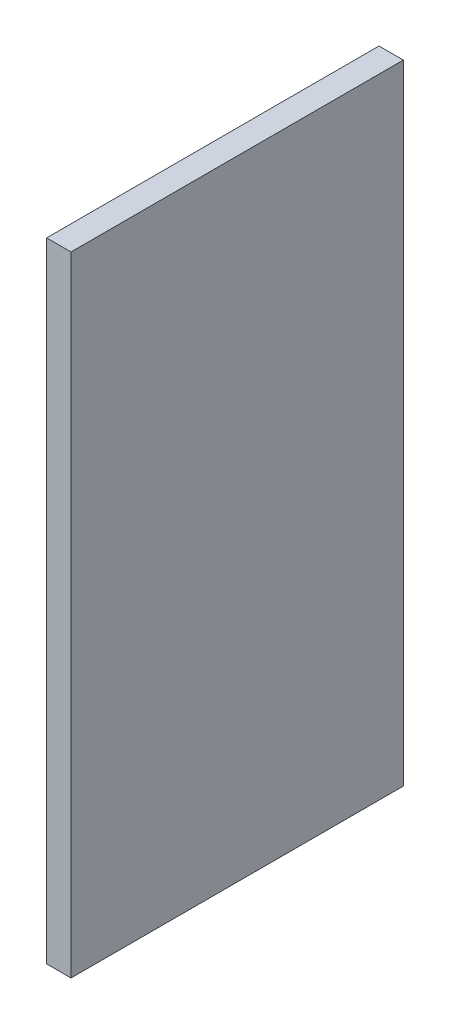
ISO-10303-21;
HEADER;
FILE_DESCRIPTION(('STEP AP214'),'2;1');
FILE_NAME('part.step','',(''),(''),'','','');
FILE_SCHEMA(('AUTOMOTIVE_DESIGN { 1 0 10303 214 1 1 1 1 }'));
ENDSEC;
DATA;
#1=APPLICATION_CONTEXT('core data for automotive mechanical design processes');
#2=APPLICATION_PROTOCOL_DEFINITION('international standard','automotive_design',2000,#1);
#3=PRODUCT_CONTEXT('',#1,'mechanical');
#4=PRODUCT('Part','Part','',(#3));
#5=PRODUCT_RELATED_PRODUCT_CATEGORY('part','',(#4));
#6=PRODUCT_DEFINITION_FORMATION('','',#4);
#7=PRODUCT_DEFINITION_CONTEXT('part definition',#1,'design');
#8=PRODUCT_DEFINITION('design','',#6,#7);
#9=PRODUCT_DEFINITION_SHAPE('','',#8);
#10=(LENGTH_UNIT() NAMED_UNIT(*) SI_UNIT(.MILLI.,.METRE.));
#11=(NAMED_UNIT(*) PLANE_ANGLE_UNIT() SI_UNIT($,.RADIAN.));
#12=(NAMED_UNIT(*) SI_UNIT($,.STERADIAN.) SOLID_ANGLE_UNIT());
#13=UNCERTAINTY_MEASURE_WITH_UNIT(LENGTH_MEASURE(1.E-05),#10,'distance_accuracy_value','');
#14=(GEOMETRIC_REPRESENTATION_CONTEXT(3) GLOBAL_UNCERTAINTY_ASSIGNED_CONTEXT((#13)) GLOBAL_UNIT_ASSIGNED_CONTEXT((#10,
#11,#12)) REPRESENTATION_CONTEXT('',''));
#15=CARTESIAN_POINT('',(0.,0.,0.));
#16=DIRECTION('',(0.,0.,1.));
#17=DIRECTION('',(1.,0.,0.));
#18=AXIS2_PLACEMENT_3D('',#15,#16,#17);
#19=CARTESIAN_POINT('',(1338.5,121.5,-818.5));
#20=DIRECTION('',(-1.,0.,0.));
#21=DIRECTION('',(0.,0.,1.));
#22=AXIS2_PLACEMENT_3D('',#19,#20,#21);
#23=PLANE('',#22);
#24=DIRECTION('',(0.,-1.,0.));
#25=VECTOR('',#24,1.);
#26=CARTESIAN_POINT('',(1338.5,121.5,0.));
#27=LINE('',#26,#25);
#28=CARTESIAN_POINT('',(1338.5,1670.,0.));
#29=VERTEX_POINT('',#28);
#30=CARTESIAN_POINT('',(1338.5,121.5,0.));
#31=VERTEX_POINT('',#30);
#32=EDGE_CURVE('E103',#29,#31,#27,.T.);
#33=ORIENTED_EDGE('',*,*,#32,.F.);
#34=DIRECTION('',(0.,0.,1.));
#35=VECTOR('',#34,1.);
#36=CARTESIAN_POINT('',(1338.5,1670.,-818.5));
#37=LINE('',#36,#35);
#38=CARTESIAN_POINT('',(1338.5,1670.,-818.5));
#39=VERTEX_POINT('',#38);
#40=EDGE_CURVE('E11',#39,#29,#37,.T.);
#41=ORIENTED_EDGE('',*,*,#40,.F.);
#42=DIRECTION('',(0.,-1.,0.));
#43=VECTOR('',#42,1.);
#44=CARTESIAN_POINT('',(1338.5,121.5,-818.5));
#45=LINE('',#44,#43);
#46=CARTESIAN_POINT('',(1338.5,121.5,-818.5));
#47=VERTEX_POINT('',#46);
#48=EDGE_CURVE('E97',#39,#47,#45,.T.);
#49=ORIENTED_EDGE('',*,*,#48,.T.);
#50=DIRECTION('',(0.,0.,1.));
#51=VECTOR('',#50,1.);
#52=CARTESIAN_POINT('',(1338.5,121.5,-818.5));
#53=LINE('',#52,#51);
#54=EDGE_CURVE('E42',#47,#31,#53,.T.);
#55=ORIENTED_EDGE('',*,*,#54,.T.);
#56=EDGE_LOOP('',(#33,#41,#49,#55));
#57=FACE_BOUND('',#56,.T.);
#58=ADVANCED_FACE('F39',(#57),#23,.T.);
#59=CARTESIAN_POINT('',(1338.5,1670.,-818.5));
#60=DIRECTION('',(0.,1.,0.));
#61=DIRECTION('',(0.,0.,1.));
#62=AXIS2_PLACEMENT_3D('',#59,#60,#61);
#63=PLANE('',#62);
#64=DIRECTION('',(-1.,0.,0.));
#65=VECTOR('',#64,1.);
#66=CARTESIAN_POINT('',(1338.5,1670.,0.));
#67=LINE('',#66,#65);
#68=CARTESIAN_POINT('',(1398.5,1670.,0.));
#69=VERTEX_POINT('',#68);
#70=EDGE_CURVE('E99',#69,#29,#67,.T.);
#71=ORIENTED_EDGE('',*,*,#70,.F.);
#72=DIRECTION('',(0.,0.,1.));
#73=VECTOR('',#72,1.);
#74=CARTESIAN_POINT('',(1398.5,1670.,-818.5));
#75=LINE('',#74,#73);
#76=CARTESIAN_POINT('',(1398.5,1670.,-818.5));
#77=VERTEX_POINT('',#76);
#78=EDGE_CURVE('E48',#77,#69,#75,.T.);
#79=ORIENTED_EDGE('',*,*,#78,.F.);
#80=DIRECTION('',(-1.,0.,0.));
#81=VECTOR('',#80,1.);
#82=CARTESIAN_POINT('',(1338.5,1670.,-818.5));
#83=LINE('',#82,#81);
#84=EDGE_CURVE('E94',#77,#39,#83,.T.);
#85=ORIENTED_EDGE('',*,*,#84,.T.);
#86=ORIENTED_EDGE('',*,*,#40,.T.);
#87=EDGE_LOOP('',(#71,#79,#85,#86));
#88=FACE_BOUND('',#87,.T.);
#89=ADVANCED_FACE('F113',(#88),#63,.T.);
#90=CARTESIAN_POINT('',(1398.5,121.5,-818.5));
#91=DIRECTION('',(1.,0.,0.));
#92=DIRECTION('',(0.,0.,-1.));
#93=AXIS2_PLACEMENT_3D('',#90,#91,#92);
#94=PLANE('',#93);
#95=DIRECTION('',(0.,1.,0.));
#96=VECTOR('',#95,1.);
#97=CARTESIAN_POINT('',(1398.5,121.5,0.));
#98=LINE('',#97,#96);
#99=CARTESIAN_POINT('',(1398.5,121.5,0.));
#100=VERTEX_POINT('',#99);
#101=EDGE_CURVE('E89',#100,#69,#98,.T.);
#102=ORIENTED_EDGE('',*,*,#101,.F.);
#103=DIRECTION('',(0.,0.,1.));
#104=VECTOR('',#103,1.);
#105=CARTESIAN_POINT('',(1398.5,121.5,-818.5));
#106=LINE('',#105,#104);
#107=CARTESIAN_POINT('',(1398.5,121.5,-818.5));
#108=VERTEX_POINT('',#107);
#109=EDGE_CURVE('E84',#108,#100,#106,.T.);
#110=ORIENTED_EDGE('',*,*,#109,.F.);
#111=DIRECTION('',(0.,1.,0.));
#112=VECTOR('',#111,1.);
#113=CARTESIAN_POINT('',(1398.5,121.5,-818.5));
#114=LINE('',#113,#112);
#115=EDGE_CURVE('E87',#108,#77,#114,.T.);
#116=ORIENTED_EDGE('',*,*,#115,.T.);
#117=ORIENTED_EDGE('',*,*,#78,.T.);
#118=EDGE_LOOP('',(#102,#110,#116,#117));
#119=FACE_BOUND('',#118,.T.);
#120=ADVANCED_FACE('F86',(#119),#94,.T.);
#121=CARTESIAN_POINT('',(1338.5,121.5,-818.5));
#122=DIRECTION('',(0.,-1.,0.));
#123=DIRECTION('',(0.,0.,-1.));
#124=AXIS2_PLACEMENT_3D('',#121,#122,#123);
#125=PLANE('',#124);
#126=DIRECTION('',(1.,0.,0.));
#127=VECTOR('',#126,1.);
#128=CARTESIAN_POINT('',(1338.5,121.5,0.));
#129=LINE('',#128,#127);
#130=EDGE_CURVE('E106',#31,#100,#129,.T.);
#131=ORIENTED_EDGE('',*,*,#130,.F.);
#132=ORIENTED_EDGE('',*,*,#54,.F.);
#133=DIRECTION('',(1.,0.,0.));
#134=VECTOR('',#133,1.);
#135=CARTESIAN_POINT('',(1338.5,121.5,-818.5));
#136=LINE('',#135,#134);
#137=EDGE_CURVE('E93',#47,#108,#136,.T.);
#138=ORIENTED_EDGE('',*,*,#137,.T.);
#139=ORIENTED_EDGE('',*,*,#109,.T.);
#140=EDGE_LOOP('',(#131,#132,#138,#139));
#141=FACE_BOUND('',#140,.T.);
#142=ADVANCED_FACE('F96',(#141),#125,.T.);
#143=CARTESIAN_POINT('',(0.,0.,-818.5));
#144=DIRECTION('',(0.,0.,-1.));
#145=DIRECTION('',(-1.,0.,0.));
#146=AXIS2_PLACEMENT_3D('',#143,#144,#145);
#147=PLANE('',#146);
#148=ORIENTED_EDGE('',*,*,#48,.F.);
#149=ORIENTED_EDGE('',*,*,#84,.F.);
#150=ORIENTED_EDGE('',*,*,#115,.F.);
#151=ORIENTED_EDGE('',*,*,#137,.F.);
#152=EDGE_LOOP('',(#148,#149,#150,#151));
#153=FACE_BOUND('',#152,.T.);
#154=ADVANCED_FACE('F92',(#153),#147,.T.);
#155=CARTESIAN_POINT('',(0.,0.,0.));
#156=DIRECTION('',(0.,0.,-1.));
#157=DIRECTION('',(-1.,0.,0.));
#158=AXIS2_PLACEMENT_3D('',#155,#156,#157);
#159=PLANE('',#158);
#160=ORIENTED_EDGE('',*,*,#32,.T.);
#161=ORIENTED_EDGE('',*,*,#130,.T.);
#162=ORIENTED_EDGE('',*,*,#101,.T.);
#163=ORIENTED_EDGE('',*,*,#70,.T.);
#164=EDGE_LOOP('',(#160,#161,#162,#163));
#165=FACE_BOUND('',#164,.T.);
#166=ADVANCED_FACE('F112',(#165),#159,.F.);
#167=CLOSED_SHELL('',(#58,#89,#120,#142,#154,#166));
#168=MANIFOLD_SOLID_BREP('B2',#167);
#169=ADVANCED_BREP_SHAPE_REPRESENTATION('',(#18,#168),#14);
#170=SHAPE_DEFINITION_REPRESENTATION(#9,#169);
ENDSEC;
END-ISO-10303-21;
